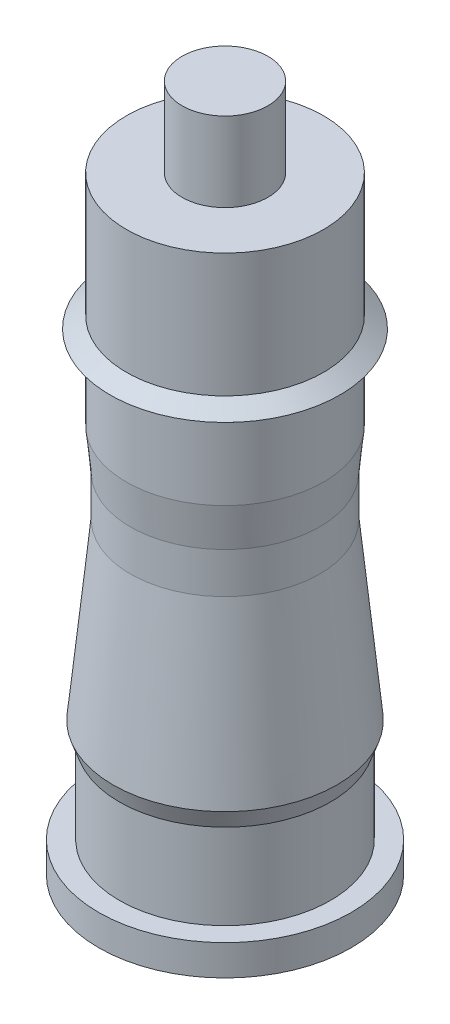
ISO-10303-21;
HEADER;
FILE_DESCRIPTION(('STEP AP214'),'2;1');
FILE_NAME('part.step','',(''),(''),'','','');
FILE_SCHEMA(('AUTOMOTIVE_DESIGN { 1 0 10303 214 1 1 1 1 }'));
ENDSEC;
DATA;
#1=APPLICATION_CONTEXT('core data for automotive mechanical design processes');
#2=APPLICATION_PROTOCOL_DEFINITION('international standard','automotive_design',2000,#1);
#3=PRODUCT_CONTEXT('',#1,'mechanical');
#4=PRODUCT('Part','Part','',(#3));
#5=PRODUCT_RELATED_PRODUCT_CATEGORY('part','',(#4));
#6=PRODUCT_DEFINITION_FORMATION('','',#4);
#7=PRODUCT_DEFINITION_CONTEXT('part definition',#1,'design');
#8=PRODUCT_DEFINITION('design','',#6,#7);
#9=PRODUCT_DEFINITION_SHAPE('','',#8);
#10=(LENGTH_UNIT() NAMED_UNIT(*) SI_UNIT(.MILLI.,.METRE.));
#11=(NAMED_UNIT(*) PLANE_ANGLE_UNIT() SI_UNIT($,.RADIAN.));
#12=(NAMED_UNIT(*) SI_UNIT($,.STERADIAN.) SOLID_ANGLE_UNIT());
#13=UNCERTAINTY_MEASURE_WITH_UNIT(LENGTH_MEASURE(1.E-05),#10,'distance_accuracy_value','');
#14=(GEOMETRIC_REPRESENTATION_CONTEXT(3) GLOBAL_UNCERTAINTY_ASSIGNED_CONTEXT((#13)) GLOBAL_UNIT_ASSIGNED_CONTEXT((#10,
#11,#12)) REPRESENTATION_CONTEXT('',''));
#15=CARTESIAN_POINT('',(0.,0.,0.));
#16=DIRECTION('',(0.,0.,1.));
#17=DIRECTION('',(1.,0.,0.));
#18=AXIS2_PLACEMENT_3D('',#15,#16,#17);
#19=CARTESIAN_POINT('',(0.,0.,0.));
#20=DIRECTION('',(0.,-1.,0.));
#21=DIRECTION('',(0.,0.,-1.));
#22=AXIS2_PLACEMENT_3D('',#19,#20,#21);
#23=PLANE('',#22);
#24=CARTESIAN_POINT('',(0.,0.,0.));
#25=DIRECTION('',(0.,-1.,0.));
#26=DIRECTION('',(0.,0.,-1.));
#27=AXIS2_PLACEMENT_3D('',#24,#25,#26);
#28=CIRCLE('',#27,6.9977);
#29=CARTESIAN_POINT('',(0.,0.,-6.9977));
#30=VERTEX_POINT('',#29);
#31=EDGE_CURVE('E10',#30,#30,#28,.T.);
#32=ORIENTED_EDGE('',*,*,#31,.T.);
#33=EDGE_LOOP('',(#32));
#34=FACE_BOUND('',#33,.T.);
#35=ADVANCED_FACE('F38',(#34),#23,.T.);
#36=CARTESIAN_POINT('',(0.,0.,0.));
#37=DIRECTION('',(0.,-1.,0.));
#38=DIRECTION('',(0.,0.,-1.));
#39=AXIS2_PLACEMENT_3D('',#36,#37,#38);
#40=CYLINDRICAL_SURFACE('',#39,6.9977);
#41=CARTESIAN_POINT('',(0.,0.79375,0.));
#42=DIRECTION('',(0.,-1.,0.));
#43=DIRECTION('',(0.,0.,-1.));
#44=AXIS2_PLACEMENT_3D('',#41,#42,#43);
#45=CIRCLE('',#44,6.9977);
#46=CARTESIAN_POINT('',(0.,0.79375,-6.9977));
#47=VERTEX_POINT('',#46);
#48=EDGE_CURVE('E44',#47,#47,#45,.T.);
#49=ORIENTED_EDGE('',*,*,#48,.T.);
#50=EDGE_LOOP('',(#49));
#51=FACE_BOUND('',#50,.T.);
#52=ORIENTED_EDGE('',*,*,#31,.F.);
#53=EDGE_LOOP('',(#52));
#54=FACE_BOUND('',#53,.T.);
#55=ADVANCED_FACE('F112',(#51,#54),#40,.T.);
#56=CARTESIAN_POINT('',(6.9977,0.79375,0.));
#57=DIRECTION('',(0.,-1.,0.));
#58=DIRECTION('',(0.,0.,-1.));
#59=AXIS2_PLACEMENT_3D('',#56,#57,#58);
#60=PLANE('',#59);
#61=CARTESIAN_POINT('',(0.,0.79375,0.));
#62=DIRECTION('',(0.,-1.,0.));
#63=DIRECTION('',(0.,0.,-1.));
#64=AXIS2_PLACEMENT_3D('',#61,#62,#63);
#65=CIRCLE('',#64,8.7757);
#66=CARTESIAN_POINT('',(0.,0.79375,-8.7757));
#67=VERTEX_POINT('',#66);
#68=EDGE_CURVE('E48',#67,#67,#65,.T.);
#69=ORIENTED_EDGE('',*,*,#68,.T.);
#70=EDGE_LOOP('',(#69));
#71=FACE_BOUND('',#70,.T.);
#72=ORIENTED_EDGE('',*,*,#48,.F.);
#73=EDGE_LOOP('',(#72));
#74=FACE_BOUND('',#73,.T.);
#75=ADVANCED_FACE('F116',(#71,#74),#60,.T.);
#76=CARTESIAN_POINT('',(0.,0.,0.));
#77=DIRECTION('',(0.,-1.,0.));
#78=DIRECTION('',(0.,0.,-1.));
#79=AXIS2_PLACEMENT_3D('',#76,#77,#78);
#80=CYLINDRICAL_SURFACE('',#79,8.7757);
#81=CARTESIAN_POINT('',(0.,0.,0.));
#82=DIRECTION('',(0.,-1.,0.));
#83=DIRECTION('',(0.,0.,-1.));
#84=AXIS2_PLACEMENT_3D('',#81,#82,#83);
#85=CIRCLE('',#84,8.7757);
#86=CARTESIAN_POINT('',(0.,0.,-8.7757));
#87=VERTEX_POINT('',#86);
#88=EDGE_CURVE('E52',#87,#87,#85,.T.);
#89=ORIENTED_EDGE('',*,*,#88,.T.);
#90=EDGE_LOOP('',(#89));
#91=FACE_BOUND('',#90,.T.);
#92=ORIENTED_EDGE('',*,*,#68,.F.);
#93=EDGE_LOOP('',(#92));
#94=FACE_BOUND('',#93,.T.);
#95=ADVANCED_FACE('F120',(#91,#94),#80,.F.);
#96=CARTESIAN_POINT('',(8.7757,0.,0.));
#97=DIRECTION('',(0.,-1.,0.));
#98=DIRECTION('',(0.,0.,-1.));
#99=AXIS2_PLACEMENT_3D('',#96,#97,#98);
#100=PLANE('',#99);
#101=CARTESIAN_POINT('',(0.,0.,0.));
#102=DIRECTION('',(0.,-1.,0.));
#103=DIRECTION('',(0.,0.,-1.));
#104=AXIS2_PLACEMENT_3D('',#101,#102,#103);
#105=CIRCLE('',#104,9.8298);
#106=CARTESIAN_POINT('',(0.,0.,-9.8298));
#107=VERTEX_POINT('',#106);
#108=EDGE_CURVE('E57',#107,#107,#105,.T.);
#109=ORIENTED_EDGE('',*,*,#108,.T.);
#110=EDGE_LOOP('',(#109));
#111=FACE_BOUND('',#110,.T.);
#112=ORIENTED_EDGE('',*,*,#88,.F.);
#113=EDGE_LOOP('',(#112));
#114=FACE_BOUND('',#113,.T.);
#115=ADVANCED_FACE('F127',(#111,#114),#100,.T.);
#116=CARTESIAN_POINT('',(0.,0.,0.));
#117=DIRECTION('',(0.,-1.,0.));
#118=DIRECTION('',(0.,0.,-1.));
#119=AXIS2_PLACEMENT_3D('',#116,#117,#118);
#120=CYLINDRICAL_SURFACE('',#119,9.8298);
#121=CARTESIAN_POINT('',(0.,2.38125,0.));
#122=DIRECTION('',(0.,-1.,0.));
#123=DIRECTION('',(0.,0.,-1.));
#124=AXIS2_PLACEMENT_3D('',#121,#122,#123);
#125=CIRCLE('',#124,9.8298);
#126=CARTESIAN_POINT('',(0.,2.38125,-9.8298));
#127=VERTEX_POINT('',#126);
#128=EDGE_CURVE('E60',#127,#127,#125,.T.);
#129=ORIENTED_EDGE('',*,*,#128,.T.);
#130=EDGE_LOOP('',(#129));
#131=FACE_BOUND('',#130,.T.);
#132=ORIENTED_EDGE('',*,*,#108,.F.);
#133=EDGE_LOOP('',(#132));
#134=FACE_BOUND('',#133,.T.);
#135=ADVANCED_FACE('F131',(#131,#134),#120,.T.);
#136=CARTESIAN_POINT('',(9.8298,2.38125,0.));
#137=DIRECTION('',(0.,1.,0.));
#138=DIRECTION('',(0.,0.,1.));
#139=AXIS2_PLACEMENT_3D('',#136,#137,#138);
#140=PLANE('',#139);
#141=CARTESIAN_POINT('',(0.,2.38125,0.));
#142=DIRECTION('',(0.,-1.,0.));
#143=DIRECTION('',(0.,0.,-1.));
#144=AXIS2_PLACEMENT_3D('',#141,#142,#143);
#145=CIRCLE('',#144,8.2169);
#146=CARTESIAN_POINT('',(0.,2.38125,-8.2169));
#147=VERTEX_POINT('',#146);
#148=EDGE_CURVE('E63',#147,#147,#145,.T.);
#149=ORIENTED_EDGE('',*,*,#148,.T.);
#150=EDGE_LOOP('',(#149));
#151=FACE_BOUND('',#150,.T.);
#152=ORIENTED_EDGE('',*,*,#128,.F.);
#153=EDGE_LOOP('',(#152));
#154=FACE_BOUND('',#153,.T.);
#155=ADVANCED_FACE('F135',(#151,#154),#140,.T.);
#156=CARTESIAN_POINT('',(0.,0.,0.));
#157=DIRECTION('',(0.,-1.,0.));
#158=DIRECTION('',(0.,0.,-1.));
#159=AXIS2_PLACEMENT_3D('',#156,#157,#158);
#160=CYLINDRICAL_SURFACE('',#159,8.2169);
#161=CARTESIAN_POINT('',(0.,9.017,0.));
#162=DIRECTION('',(0.,-1.,0.));
#163=DIRECTION('',(0.,0.,-1.));
#164=AXIS2_PLACEMENT_3D('',#161,#162,#163);
#165=CIRCLE('',#164,8.2169);
#166=CARTESIAN_POINT('',(0.,9.017,-8.2169));
#167=VERTEX_POINT('',#166);
#168=EDGE_CURVE('E66',#167,#167,#165,.T.);
#169=ORIENTED_EDGE('',*,*,#168,.T.);
#170=EDGE_LOOP('',(#169));
#171=FACE_BOUND('',#170,.T.);
#172=ORIENTED_EDGE('',*,*,#148,.F.);
#173=EDGE_LOOP('',(#172));
#174=FACE_BOUND('',#173,.T.);
#175=ADVANCED_FACE('F139',(#171,#174),#160,.T.);
#176=CARTESIAN_POINT('',(0.,9.017,0.));
#177=DIRECTION('',(0.,1.,0.));
#178=DIRECTION('',(0.,0.,1.));
#179=AXIS2_PLACEMENT_3D('',#176,#177,#178);
#180=CONICAL_SURFACE('',#179,8.2169,0.340718469001069);
#181=CARTESIAN_POINT('',(0.,10.414,0.));
#182=DIRECTION('',(0.,-1.,0.));
#183=DIRECTION('',(0.,0.,-1.));
#184=AXIS2_PLACEMENT_3D('',#181,#182,#183);
#185=CIRCLE('',#184,8.7122);
#186=CARTESIAN_POINT('',(0.,10.414,-8.7122));
#187=VERTEX_POINT('',#186);
#188=EDGE_CURVE('E69',#187,#187,#185,.T.);
#189=ORIENTED_EDGE('',*,*,#188,.T.);
#190=EDGE_LOOP('',(#189));
#191=FACE_BOUND('',#190,.T.);
#192=ORIENTED_EDGE('',*,*,#168,.F.);
#193=EDGE_LOOP('',(#192));
#194=FACE_BOUND('',#193,.T.);
#195=ADVANCED_FACE('F143',(#191,#194),#180,.T.);
#196=CARTESIAN_POINT('',(0.,10.414,0.));
#197=DIRECTION('',(0.,-1.,0.));
#198=DIRECTION('',(0.,0.,-1.));
#199=AXIS2_PLACEMENT_3D('',#196,#197,#198);
#200=CONICAL_SURFACE('',#199,8.7122,0.0991113424987033);
#201=CARTESIAN_POINT('',(0.,23.9522,0.));
#202=DIRECTION('',(0.,-1.,0.));
#203=DIRECTION('',(0.,0.,-1.));
#204=AXIS2_PLACEMENT_3D('',#201,#202,#203);
#205=CIRCLE('',#204,7.366);
#206=CARTESIAN_POINT('',(0.,23.9522,-7.366));
#207=VERTEX_POINT('',#206);
#208=EDGE_CURVE('E72',#207,#207,#205,.T.);
#209=ORIENTED_EDGE('',*,*,#208,.T.);
#210=EDGE_LOOP('',(#209));
#211=FACE_BOUND('',#210,.T.);
#212=ORIENTED_EDGE('',*,*,#188,.F.);
#213=EDGE_LOOP('',(#212));
#214=FACE_BOUND('',#213,.T.);
#215=ADVANCED_FACE('F147',(#211,#214),#200,.T.);
#216=CARTESIAN_POINT('',(0.,0.,0.));
#217=DIRECTION('',(0.,-1.,0.));
#218=DIRECTION('',(0.,0.,-1.));
#219=AXIS2_PLACEMENT_3D('',#216,#217,#218);
#220=CYLINDRICAL_SURFACE('',#219,7.366);
#221=CARTESIAN_POINT('',(0.,27.1272,0.));
#222=DIRECTION('',(0.,-1.,0.));
#223=DIRECTION('',(0.,0.,-1.));
#224=AXIS2_PLACEMENT_3D('',#221,#222,#223);
#225=CIRCLE('',#224,7.366);
#226=CARTESIAN_POINT('',(0.,27.1272,-7.366));
#227=VERTEX_POINT('',#226);
#228=EDGE_CURVE('E75',#227,#227,#225,.T.);
#229=ORIENTED_EDGE('',*,*,#228,.T.);
#230=EDGE_LOOP('',(#229));
#231=FACE_BOUND('',#230,.T.);
#232=ORIENTED_EDGE('',*,*,#208,.F.);
#233=EDGE_LOOP('',(#232));
#234=FACE_BOUND('',#233,.T.);
#235=ADVANCED_FACE('F151',(#231,#234),#220,.T.);
#236=CARTESIAN_POINT('',(0.,27.1272,0.));
#237=DIRECTION('',(0.,1.,0.));
#238=DIRECTION('',(0.,0.,1.));
#239=AXIS2_PLACEMENT_3D('',#236,#237,#238);
#240=CONICAL_SURFACE('',#239,7.366,0.0957067080868037);
#241=CARTESIAN_POINT('',(0.,30.3022,0.));
#242=DIRECTION('',(0.,-1.,0.));
#243=DIRECTION('',(0.,0.,-1.));
#244=AXIS2_PLACEMENT_3D('',#241,#242,#243);
#245=CIRCLE('',#244,7.6708);
#246=CARTESIAN_POINT('',(0.,30.3022,-7.6708));
#247=VERTEX_POINT('',#246);
#248=EDGE_CURVE('E78',#247,#247,#245,.T.);
#249=ORIENTED_EDGE('',*,*,#248,.T.);
#250=EDGE_LOOP('',(#249));
#251=FACE_BOUND('',#250,.T.);
#252=ORIENTED_EDGE('',*,*,#228,.F.);
#253=EDGE_LOOP('',(#252));
#254=FACE_BOUND('',#253,.T.);
#255=ADVANCED_FACE('F155',(#251,#254),#240,.T.);
#256=CARTESIAN_POINT('',(0.,0.,0.));
#257=DIRECTION('',(0.,-1.,0.));
#258=DIRECTION('',(0.,0.,-1.));
#259=AXIS2_PLACEMENT_3D('',#256,#257,#258);
#260=CYLINDRICAL_SURFACE('',#259,7.6708);
#261=CARTESIAN_POINT('',(0.,35.9156,0.));
#262=DIRECTION('',(0.,-1.,0.));
#263=DIRECTION('',(0.,0.,-1.));
#264=AXIS2_PLACEMENT_3D('',#261,#262,#263);
#265=CIRCLE('',#264,7.6708);
#266=CARTESIAN_POINT('',(0.,35.9156,-7.6708));
#267=VERTEX_POINT('',#266);
#268=EDGE_CURVE('E81',#267,#267,#265,.T.);
#269=ORIENTED_EDGE('',*,*,#268,.T.);
#270=EDGE_LOOP('',(#269));
#271=FACE_BOUND('',#270,.T.);
#272=ORIENTED_EDGE('',*,*,#248,.F.);
#273=EDGE_LOOP('',(#272));
#274=FACE_BOUND('',#273,.T.);
#275=ADVANCED_FACE('F159',(#271,#274),#260,.T.);
#276=CARTESIAN_POINT('',(0.,35.9156,0.));
#277=DIRECTION('',(0.,1.,0.));
#278=DIRECTION('',(0.,0.,1.));
#279=AXIS2_PLACEMENT_3D('',#276,#277,#278);
#280=CONICAL_SURFACE('',#279,7.6708,0.960070362405687);
#281=CARTESIAN_POINT('',(0.,36.8046,0.));
#282=DIRECTION('',(0.,-1.,0.));
#283=DIRECTION('',(0.,0.,-1.));
#284=AXIS2_PLACEMENT_3D('',#281,#282,#283);
#285=CIRCLE('',#284,8.9408);
#286=CARTESIAN_POINT('',(0.,36.8046,-8.9408));
#287=VERTEX_POINT('',#286);
#288=EDGE_CURVE('E84',#287,#287,#285,.T.);
#289=ORIENTED_EDGE('',*,*,#288,.T.);
#290=EDGE_LOOP('',(#289));
#291=FACE_BOUND('',#290,.T.);
#292=ORIENTED_EDGE('',*,*,#268,.F.);
#293=EDGE_LOOP('',(#292));
#294=FACE_BOUND('',#293,.T.);
#295=ADVANCED_FACE('F163',(#291,#294),#280,.T.);
#296=CARTESIAN_POINT('',(0.,36.8046,0.));
#297=DIRECTION('',(0.,-1.,0.));
#298=DIRECTION('',(0.,0.,-1.));
#299=AXIS2_PLACEMENT_3D('',#296,#297,#298);
#300=CONICAL_SURFACE('',#299,8.9408,0.960070362405687);
#301=CARTESIAN_POINT('',(0.,37.6936,0.));
#302=DIRECTION('',(0.,-1.,0.));
#303=DIRECTION('',(0.,0.,-1.));
#304=AXIS2_PLACEMENT_3D('',#301,#302,#303);
#305=CIRCLE('',#304,7.6708);
#306=CARTESIAN_POINT('',(0.,37.6936,-7.6708));
#307=VERTEX_POINT('',#306);
#308=EDGE_CURVE('E87',#307,#307,#305,.T.);
#309=ORIENTED_EDGE('',*,*,#308,.T.);
#310=EDGE_LOOP('',(#309));
#311=FACE_BOUND('',#310,.T.);
#312=ORIENTED_EDGE('',*,*,#288,.F.);
#313=EDGE_LOOP('',(#312));
#314=FACE_BOUND('',#313,.T.);
#315=ADVANCED_FACE('F167',(#311,#314),#300,.T.);
#316=CARTESIAN_POINT('',(0.,0.,0.));
#317=DIRECTION('',(0.,-1.,0.));
#318=DIRECTION('',(0.,0.,-1.));
#319=AXIS2_PLACEMENT_3D('',#316,#317,#318);
#320=CYLINDRICAL_SURFACE('',#319,7.6708);
#321=CARTESIAN_POINT('',(0.,47.3202,0.));
#322=DIRECTION('',(0.,-1.,0.));
#323=DIRECTION('',(0.,0.,-1.));
#324=AXIS2_PLACEMENT_3D('',#321,#322,#323);
#325=CIRCLE('',#324,7.6708);
#326=CARTESIAN_POINT('',(0.,47.3202,-7.6708));
#327=VERTEX_POINT('',#326);
#328=EDGE_CURVE('E90',#327,#327,#325,.T.);
#329=ORIENTED_EDGE('',*,*,#328,.T.);
#330=EDGE_LOOP('',(#329));
#331=FACE_BOUND('',#330,.T.);
#332=ORIENTED_EDGE('',*,*,#308,.F.);
#333=EDGE_LOOP('',(#332));
#334=FACE_BOUND('',#333,.T.);
#335=ADVANCED_FACE('F171',(#331,#334),#320,.T.);
#336=CARTESIAN_POINT('',(7.6708,47.3202,0.));
#337=DIRECTION('',(0.,1.,0.));
#338=DIRECTION('',(0.,0.,1.));
#339=AXIS2_PLACEMENT_3D('',#336,#337,#338);
#340=PLANE('',#339);
#341=CARTESIAN_POINT('',(0.,47.3202,0.));
#342=DIRECTION('',(0.,-1.,0.));
#343=DIRECTION('',(0.,0.,-1.));
#344=AXIS2_PLACEMENT_3D('',#341,#342,#343);
#345=CIRCLE('',#344,3.3401);
#346=CARTESIAN_POINT('',(0.,47.3202,-3.3401));
#347=VERTEX_POINT('',#346);
#348=EDGE_CURVE('E93',#347,#347,#345,.T.);
#349=ORIENTED_EDGE('',*,*,#348,.T.);
#350=EDGE_LOOP('',(#349));
#351=FACE_BOUND('',#350,.T.);
#352=ORIENTED_EDGE('',*,*,#328,.F.);
#353=EDGE_LOOP('',(#352));
#354=FACE_BOUND('',#353,.T.);
#355=ADVANCED_FACE('F109',(#351,#354),#340,.T.);
#356=CARTESIAN_POINT('',(0.,0.,0.));
#357=DIRECTION('',(0.,-1.,0.));
#358=DIRECTION('',(0.,0.,-1.));
#359=AXIS2_PLACEMENT_3D('',#356,#357,#358);
#360=CYLINDRICAL_SURFACE('',#359,3.3401);
#361=CARTESIAN_POINT('',(0.,53.4924,0.));
#362=DIRECTION('',(0.,-1.,0.));
#363=DIRECTION('',(0.,0.,-1.));
#364=AXIS2_PLACEMENT_3D('',#361,#362,#363);
#365=CIRCLE('',#364,3.3401);
#366=CARTESIAN_POINT('',(0.,53.4924,-3.3401));
#367=VERTEX_POINT('',#366);
#368=EDGE_CURVE('E96',#367,#367,#365,.T.);
#369=ORIENTED_EDGE('',*,*,#368,.T.);
#370=EDGE_LOOP('',(#369));
#371=FACE_BOUND('',#370,.T.);
#372=ORIENTED_EDGE('',*,*,#348,.F.);
#373=EDGE_LOOP('',(#372));
#374=FACE_BOUND('',#373,.T.);
#375=ADVANCED_FACE('F100',(#371,#374),#360,.T.);
#376=CARTESIAN_POINT('',(3.3401,53.4924,0.));
#377=DIRECTION('',(0.,1.,0.));
#378=DIRECTION('',(0.,0.,1.));
#379=AXIS2_PLACEMENT_3D('',#376,#377,#378);
#380=PLANE('',#379);
#381=ORIENTED_EDGE('',*,*,#368,.F.);
#382=EDGE_LOOP('',(#381));
#383=FACE_BOUND('',#382,.T.);
#384=ADVANCED_FACE('F103',(#383),#380,.T.);
#385=CLOSED_SHELL('',(#35,#55,#75,#95,#115,#135,#155,#175,#195,#215,#235,#255,#275,#295,#315,
#335,#355,#375,#384));
#386=MANIFOLD_SOLID_BREP('B2',#385);
#387=ADVANCED_BREP_SHAPE_REPRESENTATION('',(#18,#386),#14);
#388=SHAPE_DEFINITION_REPRESENTATION(#9,#387);
ENDSEC;
END-ISO-10303-21;
